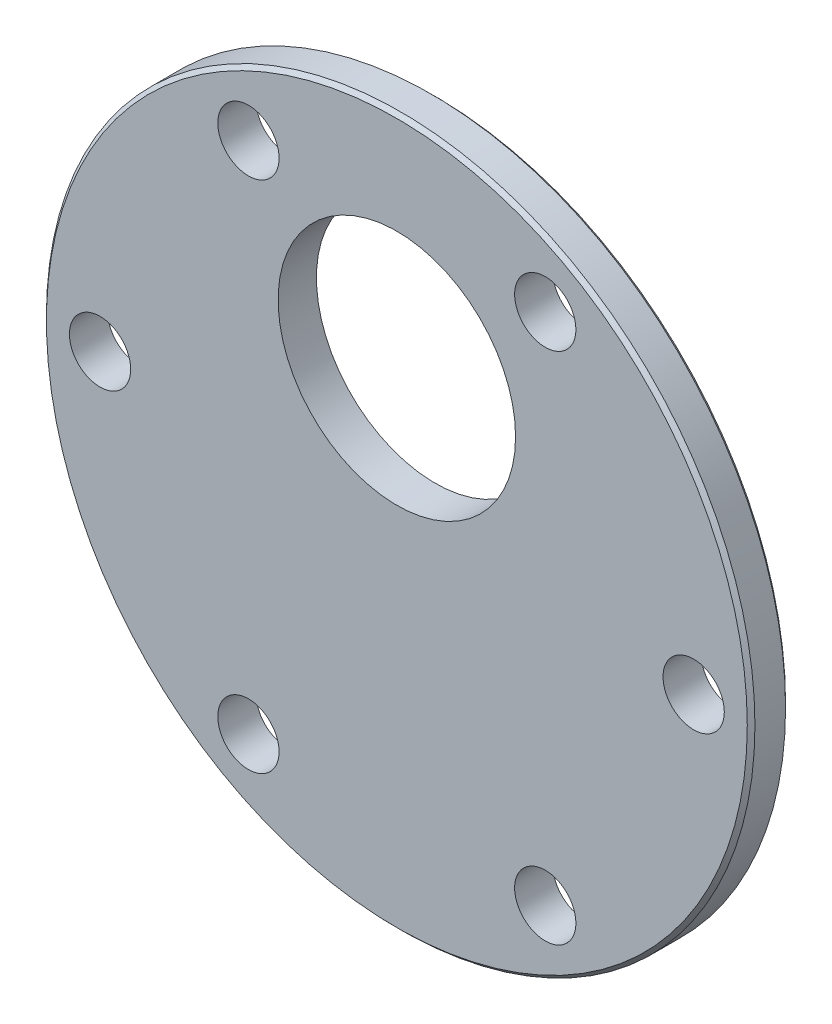
ISO-10303-21;
HEADER;
FILE_DESCRIPTION(('STEP AP214'),'2;1');
FILE_NAME('part.step','',(''),(''),'','','');
FILE_SCHEMA(('AUTOMOTIVE_DESIGN { 1 0 10303 214 1 1 1 1 }'));
ENDSEC;
DATA;
#1=APPLICATION_CONTEXT('core data for automotive mechanical design processes');
#2=APPLICATION_PROTOCOL_DEFINITION('international standard','automotive_design',2000,#1);
#3=PRODUCT_CONTEXT('',#1,'mechanical');
#4=PRODUCT('Part','Part','',(#3));
#5=PRODUCT_RELATED_PRODUCT_CATEGORY('part','',(#4));
#6=PRODUCT_DEFINITION_FORMATION('','',#4);
#7=PRODUCT_DEFINITION_CONTEXT('part definition',#1,'design');
#8=PRODUCT_DEFINITION('design','',#6,#7);
#9=PRODUCT_DEFINITION_SHAPE('','',#8);
#10=(LENGTH_UNIT() NAMED_UNIT(*) SI_UNIT(.MILLI.,.METRE.));
#11=(NAMED_UNIT(*) PLANE_ANGLE_UNIT() SI_UNIT($,.RADIAN.));
#12=(NAMED_UNIT(*) SI_UNIT($,.STERADIAN.) SOLID_ANGLE_UNIT());
#13=UNCERTAINTY_MEASURE_WITH_UNIT(LENGTH_MEASURE(1.E-05),#10,'distance_accuracy_value','');
#14=(GEOMETRIC_REPRESENTATION_CONTEXT(3) GLOBAL_UNCERTAINTY_ASSIGNED_CONTEXT((#13)) GLOBAL_UNIT_ASSIGNED_CONTEXT((#10,
#11,#12)) REPRESENTATION_CONTEXT('',''));
#15=CARTESIAN_POINT('',(0.,0.,0.));
#16=DIRECTION('',(0.,0.,1.));
#17=DIRECTION('',(1.,0.,0.));
#18=AXIS2_PLACEMENT_3D('',#15,#16,#17);
#19=CARTESIAN_POINT('',(0.,-7.,2.));
#20=DIRECTION('',(0.,0.,1.));
#21=DIRECTION('',(1.,0.,0.));
#22=AXIS2_PLACEMENT_3D('',#19,#20,#21);
#23=PLANE('',#22);
#24=CARTESIAN_POINT('',(0.,-7.,2.));
#25=DIRECTION('',(0.,0.,1.));
#26=DIRECTION('',(1.,0.,0.));
#27=AXIS2_PLACEMENT_3D('',#24,#25,#26);
#28=CIRCLE('',#27,18.3);
#29=CARTESIAN_POINT('',(18.3,-7.,2.));
#30=VERTEX_POINT('',#29);
#31=EDGE_CURVE('E10',#30,#30,#28,.T.);
#32=ORIENTED_EDGE('',*,*,#31,.T.);
#33=EDGE_LOOP('',(#32));
#34=FACE_BOUND('',#33,.T.);
#35=CARTESIAN_POINT('',(-7.74999999999987,6.42339375865887,2.));
#36=DIRECTION('',(0.,0.,1.));
#37=DIRECTION('',(1.,0.,0.));
#38=AXIS2_PLACEMENT_3D('',#35,#36,#37);
#39=CIRCLE('',#38,1.6);
#40=CARTESIAN_POINT('',(-6.14999999999987,6.42339375865887,2.));
#41=VERTEX_POINT('',#40);
#42=EDGE_CURVE('E81',#41,#41,#39,.T.);
#43=ORIENTED_EDGE('',*,*,#42,.F.);
#44=EDGE_LOOP('',(#43));
#45=FACE_BOUND('',#44,.T.);
#46=CARTESIAN_POINT('',(-7.75000000000006,-20.4233937586588,2.));
#47=DIRECTION('',(0.,0.,1.));
#48=DIRECTION('',(1.,0.,0.));
#49=AXIS2_PLACEMENT_3D('',#46,#47,#48);
#50=CIRCLE('',#49,1.6);
#51=CARTESIAN_POINT('',(-6.15000000000006,-20.4233937586588,2.));
#52=VERTEX_POINT('',#51);
#53=EDGE_CURVE('E69',#52,#52,#50,.T.);
#54=ORIENTED_EDGE('',*,*,#53,.F.);
#55=EDGE_LOOP('',(#54));
#56=FACE_BOUND('',#55,.T.);
#57=CARTESIAN_POINT('',(15.5,-7.,2.));
#58=DIRECTION('',(0.,0.,1.));
#59=DIRECTION('',(1.,0.,0.));
#60=AXIS2_PLACEMENT_3D('',#57,#58,#59);
#61=CIRCLE('',#60,1.6);
#62=CARTESIAN_POINT('',(17.1,-7.,2.));
#63=VERTEX_POINT('',#62);
#64=EDGE_CURVE('E57',#63,#63,#61,.T.);
#65=ORIENTED_EDGE('',*,*,#64,.F.);
#66=EDGE_LOOP('',(#65));
#67=FACE_BOUND('',#66,.T.);
#68=CARTESIAN_POINT('',(0.,0.,2.));
#69=DIRECTION('',(0.,0.,1.));
#70=DIRECTION('',(1.,0.,0.));
#71=AXIS2_PLACEMENT_3D('',#68,#69,#70);
#72=CIRCLE('',#71,6.2);
#73=CARTESIAN_POINT('',(6.2,0.,2.));
#74=VERTEX_POINT('',#73);
#75=EDGE_CURVE('E53',#74,#74,#72,.T.);
#76=ORIENTED_EDGE('',*,*,#75,.F.);
#77=EDGE_LOOP('',(#76));
#78=FACE_BOUND('',#77,.T.);
#79=CARTESIAN_POINT('',(7.74999999999996,-20.4233937586588,2.));
#80=DIRECTION('',(0.,0.,1.));
#81=DIRECTION('',(1.,0.,0.));
#82=AXIS2_PLACEMENT_3D('',#79,#80,#81);
#83=CIRCLE('',#82,1.6);
#84=CARTESIAN_POINT('',(9.34999999999996,-20.4233937586588,2.));
#85=VERTEX_POINT('',#84);
#86=EDGE_CURVE('E63',#85,#85,#83,.T.);
#87=ORIENTED_EDGE('',*,*,#86,.F.);
#88=EDGE_LOOP('',(#87));
#89=FACE_BOUND('',#88,.T.);
#90=CARTESIAN_POINT('',(-15.5,-6.99999999999989,2.));
#91=DIRECTION('',(0.,0.,1.));
#92=DIRECTION('',(1.,0.,0.));
#93=AXIS2_PLACEMENT_3D('',#90,#91,#92);
#94=CIRCLE('',#93,1.6);
#95=CARTESIAN_POINT('',(-13.9,-6.99999999999989,2.));
#96=VERTEX_POINT('',#95);
#97=EDGE_CURVE('E75',#96,#96,#94,.T.);
#98=ORIENTED_EDGE('',*,*,#97,.F.);
#99=EDGE_LOOP('',(#98));
#100=FACE_BOUND('',#99,.T.);
#101=CARTESIAN_POINT('',(7.75000000000016,6.42339375865871,2.));
#102=DIRECTION('',(0.,0.,1.));
#103=DIRECTION('',(1.,0.,0.));
#104=AXIS2_PLACEMENT_3D('',#101,#102,#103);
#105=CIRCLE('',#104,1.6);
#106=CARTESIAN_POINT('',(9.35000000000016,6.42339375865871,2.));
#107=VERTEX_POINT('',#106);
#108=EDGE_CURVE('E87',#107,#107,#105,.T.);
#109=ORIENTED_EDGE('',*,*,#108,.F.);
#110=EDGE_LOOP('',(#109));
#111=FACE_BOUND('',#110,.T.);
#112=ADVANCED_FACE('F33',(#34,#45,#56,#67,#78,#89,#100,#111),#23,.T.);
#113=CARTESIAN_POINT('',(0.,-7.,0.));
#114=DIRECTION('',(0.,0.,1.));
#115=DIRECTION('',(1.,0.,0.));
#116=AXIS2_PLACEMENT_3D('',#113,#114,#115);
#117=PLANE('',#116);
#118=CARTESIAN_POINT('',(0.,-7.,0.));
#119=DIRECTION('',(0.,0.,1.));
#120=DIRECTION('',(1.,0.,0.));
#121=AXIS2_PLACEMENT_3D('',#118,#119,#120);
#122=CIRCLE('',#121,18.3);
#123=CARTESIAN_POINT('',(18.3,-7.,0.));
#124=VERTEX_POINT('',#123);
#125=EDGE_CURVE('E40',#124,#124,#122,.F.);
#126=ORIENTED_EDGE('',*,*,#125,.T.);
#127=EDGE_LOOP('',(#126));
#128=FACE_BOUND('',#127,.T.);
#129=CARTESIAN_POINT('',(0.,0.,0.));
#130=DIRECTION('',(0.,0.,1.));
#131=DIRECTION('',(1.,0.,0.));
#132=AXIS2_PLACEMENT_3D('',#129,#130,#131);
#133=CIRCLE('',#132,6.2);
#134=CARTESIAN_POINT('',(6.2,0.,0.));
#135=VERTEX_POINT('',#134);
#136=EDGE_CURVE('E54',#135,#135,#133,.T.);
#137=ORIENTED_EDGE('',*,*,#136,.T.);
#138=EDGE_LOOP('',(#137));
#139=FACE_BOUND('',#138,.T.);
#140=CARTESIAN_POINT('',(15.5,-7.,0.));
#141=DIRECTION('',(0.,0.,1.));
#142=DIRECTION('',(1.,0.,0.));
#143=AXIS2_PLACEMENT_3D('',#140,#141,#142);
#144=CIRCLE('',#143,1.6);
#145=CARTESIAN_POINT('',(17.1,-7.,0.));
#146=VERTEX_POINT('',#145);
#147=EDGE_CURVE('E60',#146,#146,#144,.T.);
#148=ORIENTED_EDGE('',*,*,#147,.T.);
#149=EDGE_LOOP('',(#148));
#150=FACE_BOUND('',#149,.T.);
#151=CARTESIAN_POINT('',(7.74999999999996,-20.4233937586588,0.));
#152=DIRECTION('',(0.,0.,1.));
#153=DIRECTION('',(1.,0.,0.));
#154=AXIS2_PLACEMENT_3D('',#151,#152,#153);
#155=CIRCLE('',#154,1.6);
#156=CARTESIAN_POINT('',(9.34999999999996,-20.4233937586588,0.));
#157=VERTEX_POINT('',#156);
#158=EDGE_CURVE('E66',#157,#157,#155,.T.);
#159=ORIENTED_EDGE('',*,*,#158,.T.);
#160=EDGE_LOOP('',(#159));
#161=FACE_BOUND('',#160,.T.);
#162=CARTESIAN_POINT('',(-7.75000000000006,-20.4233937586588,0.));
#163=DIRECTION('',(0.,0.,1.));
#164=DIRECTION('',(1.,0.,0.));
#165=AXIS2_PLACEMENT_3D('',#162,#163,#164);
#166=CIRCLE('',#165,1.6);
#167=CARTESIAN_POINT('',(-6.15000000000006,-20.4233937586588,0.));
#168=VERTEX_POINT('',#167);
#169=EDGE_CURVE('E72',#168,#168,#166,.T.);
#170=ORIENTED_EDGE('',*,*,#169,.T.);
#171=EDGE_LOOP('',(#170));
#172=FACE_BOUND('',#171,.T.);
#173=CARTESIAN_POINT('',(-15.5,-6.99999999999989,0.));
#174=DIRECTION('',(0.,0.,1.));
#175=DIRECTION('',(1.,0.,0.));
#176=AXIS2_PLACEMENT_3D('',#173,#174,#175);
#177=CIRCLE('',#176,1.6);
#178=CARTESIAN_POINT('',(-13.9,-6.99999999999989,0.));
#179=VERTEX_POINT('',#178);
#180=EDGE_CURVE('E78',#179,#179,#177,.T.);
#181=ORIENTED_EDGE('',*,*,#180,.T.);
#182=EDGE_LOOP('',(#181));
#183=FACE_BOUND('',#182,.T.);
#184=CARTESIAN_POINT('',(-7.74999999999987,6.42339375865887,0.));
#185=DIRECTION('',(0.,0.,1.));
#186=DIRECTION('',(1.,0.,0.));
#187=AXIS2_PLACEMENT_3D('',#184,#185,#186);
#188=CIRCLE('',#187,1.6);
#189=CARTESIAN_POINT('',(-6.14999999999987,6.42339375865887,0.));
#190=VERTEX_POINT('',#189);
#191=EDGE_CURVE('E84',#190,#190,#188,.T.);
#192=ORIENTED_EDGE('',*,*,#191,.T.);
#193=EDGE_LOOP('',(#192));
#194=FACE_BOUND('',#193,.T.);
#195=CARTESIAN_POINT('',(7.75000000000016,6.42339375865871,0.));
#196=DIRECTION('',(0.,0.,1.));
#197=DIRECTION('',(1.,0.,0.));
#198=AXIS2_PLACEMENT_3D('',#195,#196,#197);
#199=CIRCLE('',#198,1.6);
#200=CARTESIAN_POINT('',(9.35000000000016,6.42339375865871,0.));
#201=VERTEX_POINT('',#200);
#202=EDGE_CURVE('E90',#201,#201,#199,.T.);
#203=ORIENTED_EDGE('',*,*,#202,.T.);
#204=EDGE_LOOP('',(#203));
#205=FACE_BOUND('',#204,.T.);
#206=ADVANCED_FACE('F100',(#128,#139,#150,#161,#172,#183,#194,#205),#117,.F.);
#207=CARTESIAN_POINT('',(0.,-7.,2.));
#208=DIRECTION('',(0.,0.,-1.));
#209=DIRECTION('',(-1.,0.,0.));
#210=AXIS2_PLACEMENT_3D('',#207,#208,#209);
#211=CYLINDRICAL_SURFACE('',#210,18.5);
#212=CARTESIAN_POINT('',(0.,-7.,0.200000000000002));
#213=DIRECTION('',(0.,0.,1.));
#214=DIRECTION('',(1.,0.,0.));
#215=AXIS2_PLACEMENT_3D('',#212,#213,#214);
#216=CIRCLE('',#215,18.5);
#217=CARTESIAN_POINT('',(18.5,-7.,0.200000000000002));
#218=VERTEX_POINT('',#217);
#219=EDGE_CURVE('E44',#218,#218,#216,.T.);
#220=ORIENTED_EDGE('',*,*,#219,.T.);
#221=EDGE_LOOP('',(#220));
#222=FACE_BOUND('',#221,.T.);
#223=CARTESIAN_POINT('',(0.,-7.,1.8));
#224=DIRECTION('',(0.,0.,1.));
#225=DIRECTION('',(1.,0.,0.));
#226=AXIS2_PLACEMENT_3D('',#223,#224,#225);
#227=CIRCLE('',#226,18.5);
#228=CARTESIAN_POINT('',(18.5,-7.,1.8));
#229=VERTEX_POINT('',#228);
#230=EDGE_CURVE('E48',#229,#229,#227,.F.);
#231=ORIENTED_EDGE('',*,*,#230,.T.);
#232=EDGE_LOOP('',(#231));
#233=FACE_BOUND('',#232,.T.);
#234=ADVANCED_FACE('F105',(#222,#233),#211,.T.);
#235=CARTESIAN_POINT('',(0.,0.,2.));
#236=DIRECTION('',(0.,0.,-1.));
#237=DIRECTION('',(-1.,0.,0.));
#238=AXIS2_PLACEMENT_3D('',#235,#236,#237);
#239=CYLINDRICAL_SURFACE('',#238,6.2);
#240=ORIENTED_EDGE('',*,*,#75,.T.);
#241=EDGE_LOOP('',(#240));
#242=FACE_BOUND('',#241,.T.);
#243=ORIENTED_EDGE('',*,*,#136,.F.);
#244=EDGE_LOOP('',(#243));
#245=FACE_BOUND('',#244,.T.);
#246=ADVANCED_FACE('F109',(#242,#245),#239,.F.);
#247=CARTESIAN_POINT('',(15.5,-7.,2.));
#248=DIRECTION('',(0.,0.,-1.));
#249=DIRECTION('',(-1.,0.,0.));
#250=AXIS2_PLACEMENT_3D('',#247,#248,#249);
#251=CYLINDRICAL_SURFACE('',#250,1.6);
#252=ORIENTED_EDGE('',*,*,#64,.T.);
#253=EDGE_LOOP('',(#252));
#254=FACE_BOUND('',#253,.T.);
#255=ORIENTED_EDGE('',*,*,#147,.F.);
#256=EDGE_LOOP('',(#255));
#257=FACE_BOUND('',#256,.T.);
#258=ADVANCED_FACE('F145',(#254,#257),#251,.F.);
#259=CARTESIAN_POINT('',(7.74999999999996,-20.4233937586588,2.));
#260=DIRECTION('',(0.,0.,-1.));
#261=DIRECTION('',(-1.,0.,0.));
#262=AXIS2_PLACEMENT_3D('',#259,#260,#261);
#263=CYLINDRICAL_SURFACE('',#262,1.6);
#264=ORIENTED_EDGE('',*,*,#86,.T.);
#265=EDGE_LOOP('',(#264));
#266=FACE_BOUND('',#265,.T.);
#267=ORIENTED_EDGE('',*,*,#158,.F.);
#268=EDGE_LOOP('',(#267));
#269=FACE_BOUND('',#268,.T.);
#270=ADVANCED_FACE('F142',(#266,#269),#263,.F.);
#271=CARTESIAN_POINT('',(-7.75000000000006,-20.4233937586588,2.));
#272=DIRECTION('',(0.,0.,-1.));
#273=DIRECTION('',(-1.,0.,0.));
#274=AXIS2_PLACEMENT_3D('',#271,#272,#273);
#275=CYLINDRICAL_SURFACE('',#274,1.6);
#276=ORIENTED_EDGE('',*,*,#53,.T.);
#277=EDGE_LOOP('',(#276));
#278=FACE_BOUND('',#277,.T.);
#279=ORIENTED_EDGE('',*,*,#169,.F.);
#280=EDGE_LOOP('',(#279));
#281=FACE_BOUND('',#280,.T.);
#282=ADVANCED_FACE('F138',(#278,#281),#275,.F.);
#283=CARTESIAN_POINT('',(-15.5,-6.99999999999989,2.));
#284=DIRECTION('',(0.,0.,-1.));
#285=DIRECTION('',(-1.,0.,0.));
#286=AXIS2_PLACEMENT_3D('',#283,#284,#285);
#287=CYLINDRICAL_SURFACE('',#286,1.6);
#288=ORIENTED_EDGE('',*,*,#97,.T.);
#289=EDGE_LOOP('',(#288));
#290=FACE_BOUND('',#289,.T.);
#291=ORIENTED_EDGE('',*,*,#180,.F.);
#292=EDGE_LOOP('',(#291));
#293=FACE_BOUND('',#292,.T.);
#294=ADVANCED_FACE('F132',(#290,#293),#287,.F.);
#295=CARTESIAN_POINT('',(-7.74999999999987,6.42339375865887,2.));
#296=DIRECTION('',(0.,0.,-1.));
#297=DIRECTION('',(-1.,0.,0.));
#298=AXIS2_PLACEMENT_3D('',#295,#296,#297);
#299=CYLINDRICAL_SURFACE('',#298,1.6);
#300=ORIENTED_EDGE('',*,*,#42,.T.);
#301=EDGE_LOOP('',(#300));
#302=FACE_BOUND('',#301,.T.);
#303=ORIENTED_EDGE('',*,*,#191,.F.);
#304=EDGE_LOOP('',(#303));
#305=FACE_BOUND('',#304,.T.);
#306=ADVANCED_FACE('F122',(#302,#305),#299,.F.);
#307=CARTESIAN_POINT('',(7.75000000000016,6.42339375865871,2.));
#308=DIRECTION('',(0.,0.,-1.));
#309=DIRECTION('',(-1.,0.,0.));
#310=AXIS2_PLACEMENT_3D('',#307,#308,#309);
#311=CYLINDRICAL_SURFACE('',#310,1.6);
#312=ORIENTED_EDGE('',*,*,#108,.T.);
#313=EDGE_LOOP('',(#312));
#314=FACE_BOUND('',#313,.T.);
#315=ORIENTED_EDGE('',*,*,#202,.F.);
#316=EDGE_LOOP('',(#315));
#317=FACE_BOUND('',#316,.T.);
#318=ADVANCED_FACE('F96',(#314,#317),#311,.F.);
#319=CARTESIAN_POINT('',(0.,-7.,0.200000000000002));
#320=DIRECTION('',(0.,0.,1.));
#321=DIRECTION('',(1.,0.,0.));
#322=AXIS2_PLACEMENT_3D('',#319,#320,#321);
#323=CONICAL_SURFACE('',#322,18.5,0.785398163397431);
#324=ORIENTED_EDGE('',*,*,#125,.F.);
#325=EDGE_LOOP('',(#324));
#326=FACE_BOUND('',#325,.T.);
#327=ORIENTED_EDGE('',*,*,#219,.F.);
#328=EDGE_LOOP('',(#327));
#329=FACE_BOUND('',#328,.T.);
#330=ADVANCED_FACE('F114',(#326,#329),#323,.T.);
#331=CARTESIAN_POINT('',(0.,-7.,2.));
#332=DIRECTION('',(0.,0.,-1.));
#333=DIRECTION('',(-1.,0.,0.));
#334=AXIS2_PLACEMENT_3D('',#331,#332,#333);
#335=CONICAL_SURFACE('',#334,18.3,0.785398163397448);
#336=ORIENTED_EDGE('',*,*,#230,.F.);
#337=EDGE_LOOP('',(#336));
#338=FACE_BOUND('',#337,.T.);
#339=ORIENTED_EDGE('',*,*,#31,.F.);
#340=EDGE_LOOP('',(#339));
#341=FACE_BOUND('',#340,.T.);
#342=ADVANCED_FACE('F35',(#338,#341),#335,.T.);
#343=CLOSED_SHELL('',(#112,#206,#234,#246,#258,#270,#282,#294,#306,#318,#330,#342));
#344=MANIFOLD_SOLID_BREP('B2',#343);
#345=ADVANCED_BREP_SHAPE_REPRESENTATION('',(#18,#344),#14);
#346=SHAPE_DEFINITION_REPRESENTATION(#9,#345);
ENDSEC;
END-ISO-10303-21;
